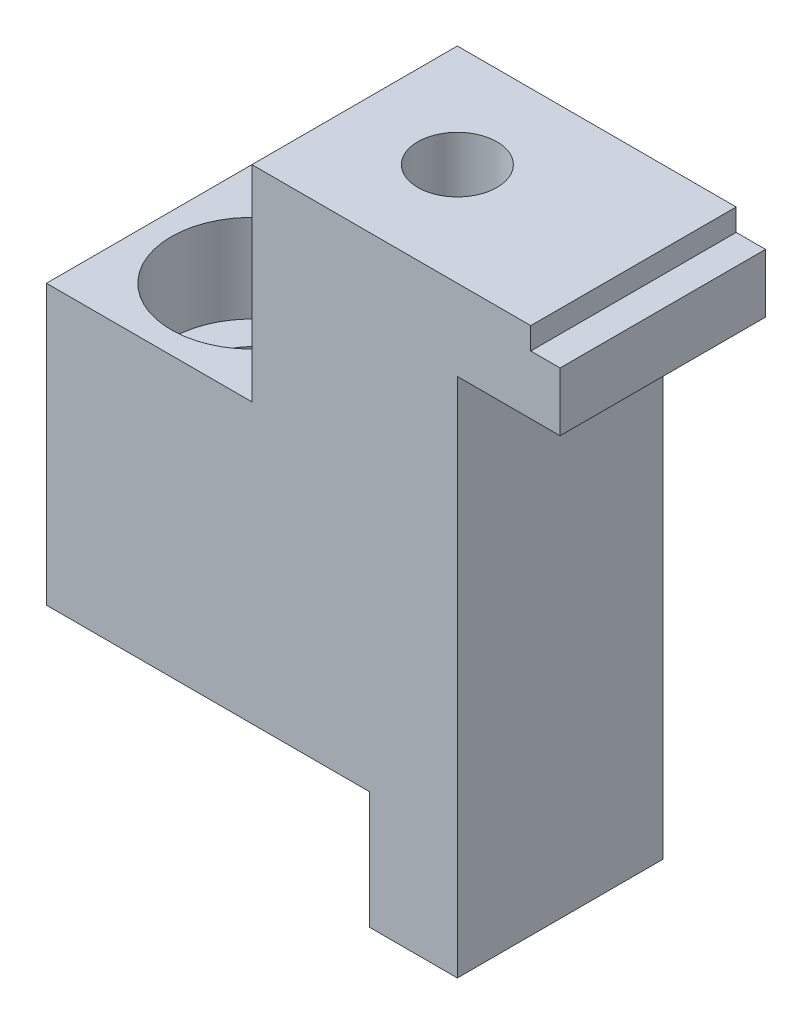
ISO-10303-21;
HEADER;
FILE_DESCRIPTION(('STEP AP214'),'2;1');
FILE_NAME('part.step','',(''),(''),'','','');
FILE_SCHEMA(('AUTOMOTIVE_DESIGN { 1 0 10303 214 1 1 1 1 }'));
ENDSEC;
DATA;
#1=APPLICATION_CONTEXT('core data for automotive mechanical design processes');
#2=APPLICATION_PROTOCOL_DEFINITION('international standard','automotive_design',2000,#1);
#3=PRODUCT_CONTEXT('',#1,'mechanical');
#4=PRODUCT('Part','Part','',(#3));
#5=PRODUCT_RELATED_PRODUCT_CATEGORY('part','',(#4));
#6=PRODUCT_DEFINITION_FORMATION('','',#4);
#7=PRODUCT_DEFINITION_CONTEXT('part definition',#1,'design');
#8=PRODUCT_DEFINITION('design','',#6,#7);
#9=PRODUCT_DEFINITION_SHAPE('','',#8);
#10=(LENGTH_UNIT() NAMED_UNIT(*) SI_UNIT(.MILLI.,.METRE.));
#11=(NAMED_UNIT(*) PLANE_ANGLE_UNIT() SI_UNIT($,.RADIAN.));
#12=(NAMED_UNIT(*) SI_UNIT($,.STERADIAN.) SOLID_ANGLE_UNIT());
#13=UNCERTAINTY_MEASURE_WITH_UNIT(LENGTH_MEASURE(1.E-05),#10,'distance_accuracy_value','');
#14=(GEOMETRIC_REPRESENTATION_CONTEXT(3) GLOBAL_UNCERTAINTY_ASSIGNED_CONTEXT((#13)) GLOBAL_UNIT_ASSIGNED_CONTEXT((#10,
#11,#12)) REPRESENTATION_CONTEXT('',''));
#15=CARTESIAN_POINT('',(0.,0.,0.));
#16=DIRECTION('',(0.,0.,1.));
#17=DIRECTION('',(1.,0.,0.));
#18=AXIS2_PLACEMENT_3D('',#15,#16,#17);
#19=CARTESIAN_POINT('',(-3.5,-4.40000000000001,3.5));
#20=DIRECTION('',(0.,1.,0.));
#21=DIRECTION('',(-1.,0.,0.));
#22=AXIS2_PLACEMENT_3D('',#19,#20,#21);
#23=CYLINDRICAL_SURFACE('',#22,1.6);
#24=CARTESIAN_POINT('',(-3.5,0.,3.5));
#25=DIRECTION('',(0.,1.,0.));
#26=DIRECTION('',(0.,0.,1.));
#27=AXIS2_PLACEMENT_3D('',#24,#25,#26);
#28=CIRCLE('',#27,1.6);
#29=CARTESIAN_POINT('',(-3.5,0.,5.1));
#30=VERTEX_POINT('',#29);
#31=EDGE_CURVE('E439',#30,#30,#28,.T.);
#32=ORIENTED_EDGE('',*,*,#31,.F.);
#33=EDGE_LOOP('',(#32));
#34=FACE_BOUND('',#33,.T.);
#35=CARTESIAN_POINT('',(-3.5,6.5,3.5));
#36=DIRECTION('',(0.,1.,0.));
#37=DIRECTION('',(-1.,0.,0.));
#38=AXIS2_PLACEMENT_3D('',#35,#36,#37);
#39=CIRCLE('',#38,1.6);
#40=CARTESIAN_POINT('',(-5.1,6.5,3.5));
#41=VERTEX_POINT('',#40);
#42=EDGE_CURVE('E36',#41,#41,#39,.F.);
#43=ORIENTED_EDGE('',*,*,#42,.F.);
#44=EDGE_LOOP('',(#43));
#45=FACE_BOUND('',#44,.T.);
#46=ADVANCED_FACE('F32',(#34,#45),#23,.F.);
#47=CARTESIAN_POINT('',(0.,0.,7.));
#48=DIRECTION('',(0.,1.,0.));
#49=DIRECTION('',(0.,0.,1.));
#50=AXIS2_PLACEMENT_3D('',#47,#48,#49);
#51=PLANE('',#50);
#52=ORIENTED_EDGE('',*,*,#31,.T.);
#53=EDGE_LOOP('',(#52));
#54=FACE_BOUND('',#53,.T.);
#55=DIRECTION('',(1.,0.,0.));
#56=VECTOR('',#55,1.);
#57=CARTESIAN_POINT('',(0.,0.,0.));
#58=LINE('',#57,#56);
#59=CARTESIAN_POINT('',(-7.,0.,0.));
#60=VERTEX_POINT('',#59);
#61=CARTESIAN_POINT('',(4.,0.,0.));
#62=VERTEX_POINT('',#61);
#63=EDGE_CURVE('E98',#60,#62,#58,.T.);
#64=ORIENTED_EDGE('',*,*,#63,.T.);
#65=DIRECTION('',(0.,0.,-1.));
#66=VECTOR('',#65,1.);
#67=CARTESIAN_POINT('',(4.,0.,7.));
#68=LINE('',#67,#66);
#69=CARTESIAN_POINT('',(4.,0.,7.));
#70=VERTEX_POINT('',#69);
#71=EDGE_CURVE('E11',#70,#62,#68,.T.);
#72=ORIENTED_EDGE('',*,*,#71,.F.);
#73=DIRECTION('',(1.,0.,0.));
#74=VECTOR('',#73,1.);
#75=CARTESIAN_POINT('',(0.,0.,7.));
#76=LINE('',#75,#74);
#77=CARTESIAN_POINT('',(-7.,0.,7.));
#78=VERTEX_POINT('',#77);
#79=EDGE_CURVE('E104',#78,#70,#76,.T.);
#80=ORIENTED_EDGE('',*,*,#79,.F.);
#81=DIRECTION('',(0.,0.,-1.));
#82=VECTOR('',#81,1.);
#83=CARTESIAN_POINT('',(-7.,0.,7.));
#84=LINE('',#83,#82);
#85=EDGE_CURVE('E150',#78,#60,#84,.T.);
#86=ORIENTED_EDGE('',*,*,#85,.T.);
#87=EDGE_LOOP('',(#64,#72,#80,#86));
#88=FACE_BOUND('',#87,.T.);
#89=ADVANCED_FACE('F34',(#54,#88),#51,.F.);
#90=CARTESIAN_POINT('',(4.,0.,7.));
#91=DIRECTION('',(1.,0.,0.));
#92=DIRECTION('',(0.,0.,-1.));
#93=AXIS2_PLACEMENT_3D('',#90,#91,#92);
#94=PLANE('',#93);
#95=DIRECTION('',(0.,-1.,0.));
#96=VECTOR('',#95,1.);
#97=CARTESIAN_POINT('',(4.,0.,0.));
#98=LINE('',#97,#96);
#99=CARTESIAN_POINT('',(4.,-4.,0.));
#100=VERTEX_POINT('',#99);
#101=EDGE_CURVE('E155',#62,#100,#98,.T.);
#102=ORIENTED_EDGE('',*,*,#101,.T.);
#103=DIRECTION('',(0.,0.,-1.));
#104=VECTOR('',#103,1.);
#105=CARTESIAN_POINT('',(4.,-4.,7.));
#106=LINE('',#105,#104);
#107=CARTESIAN_POINT('',(4.,-4.,7.));
#108=VERTEX_POINT('',#107);
#109=EDGE_CURVE('E42',#108,#100,#106,.T.);
#110=ORIENTED_EDGE('',*,*,#109,.F.);
#111=DIRECTION('',(0.,-1.,0.));
#112=VECTOR('',#111,1.);
#113=CARTESIAN_POINT('',(4.,0.,7.));
#114=LINE('',#113,#112);
#115=EDGE_CURVE('E245',#70,#108,#114,.T.);
#116=ORIENTED_EDGE('',*,*,#115,.F.);
#117=ORIENTED_EDGE('',*,*,#71,.T.);
#118=EDGE_LOOP('',(#102,#110,#116,#117));
#119=FACE_BOUND('',#118,.T.);
#120=ADVANCED_FACE('F251',(#119),#94,.F.);
#121=CARTESIAN_POINT('',(7.,-4.,7.));
#122=DIRECTION('',(0.,1.,0.));
#123=DIRECTION('',(0.,0.,1.));
#124=AXIS2_PLACEMENT_3D('',#121,#122,#123);
#125=PLANE('',#124);
#126=DIRECTION('',(1.,0.,0.));
#127=VECTOR('',#126,1.);
#128=CARTESIAN_POINT('',(7.,-4.,0.));
#129=LINE('',#128,#127);
#130=CARTESIAN_POINT('',(7.,-4.,0.));
#131=VERTEX_POINT('',#130);
#132=EDGE_CURVE('E158',#100,#131,#129,.T.);
#133=ORIENTED_EDGE('',*,*,#132,.T.);
#134=DIRECTION('',(0.,0.,-1.));
#135=VECTOR('',#134,1.);
#136=CARTESIAN_POINT('',(7.,-4.,7.));
#137=LINE('',#136,#135);
#138=CARTESIAN_POINT('',(7.,-4.,7.));
#139=VERTEX_POINT('',#138);
#140=EDGE_CURVE('E197',#139,#131,#137,.T.);
#141=ORIENTED_EDGE('',*,*,#140,.F.);
#142=DIRECTION('',(1.,0.,0.));
#143=VECTOR('',#142,1.);
#144=CARTESIAN_POINT('',(7.,-4.,7.));
#145=LINE('',#144,#143);
#146=EDGE_CURVE('E207',#108,#139,#145,.T.);
#147=ORIENTED_EDGE('',*,*,#146,.F.);
#148=ORIENTED_EDGE('',*,*,#109,.T.);
#149=EDGE_LOOP('',(#133,#141,#147,#148));
#150=FACE_BOUND('',#149,.T.);
#151=ADVANCED_FACE('F205',(#150),#125,.F.);
#152=CARTESIAN_POINT('',(7.,0.,7.));
#153=DIRECTION('',(-1.,0.,0.));
#154=DIRECTION('',(0.,0.,1.));
#155=AXIS2_PLACEMENT_3D('',#152,#153,#154);
#156=PLANE('',#155);
#157=DIRECTION('',(0.,1.,0.));
#158=VECTOR('',#157,1.);
#159=CARTESIAN_POINT('',(7.,0.,0.));
#160=LINE('',#159,#158);
#161=CARTESIAN_POINT('',(7.,13.75,0.));
#162=VERTEX_POINT('',#161);
#163=EDGE_CURVE('E161',#131,#162,#160,.T.);
#164=ORIENTED_EDGE('',*,*,#163,.T.);
#165=DIRECTION('',(0.,0.,-1.));
#166=VECTOR('',#165,1.);
#167=CARTESIAN_POINT('',(7.,13.75,7.));
#168=LINE('',#167,#166);
#169=CARTESIAN_POINT('',(7.,13.75,7.));
#170=VERTEX_POINT('',#169);
#171=EDGE_CURVE('E194',#170,#162,#168,.T.);
#172=ORIENTED_EDGE('',*,*,#171,.F.);
#173=DIRECTION('',(0.,1.,0.));
#174=VECTOR('',#173,1.);
#175=CARTESIAN_POINT('',(7.,0.,7.));
#176=LINE('',#175,#174);
#177=EDGE_CURVE('E224',#139,#170,#176,.T.);
#178=ORIENTED_EDGE('',*,*,#177,.F.);
#179=ORIENTED_EDGE('',*,*,#140,.T.);
#180=EDGE_LOOP('',(#164,#172,#178,#179));
#181=FACE_BOUND('',#180,.T.);
#182=ADVANCED_FACE('F215',(#181),#156,.F.);
#183=CARTESIAN_POINT('',(7.,13.75,7.));
#184=DIRECTION('',(0.,1.,0.));
#185=DIRECTION('',(0.,0.,1.));
#186=AXIS2_PLACEMENT_3D('',#183,#184,#185);
#187=PLANE('',#186);
#188=DIRECTION('',(1.,0.,0.));
#189=VECTOR('',#188,1.);
#190=CARTESIAN_POINT('',(7.,13.75,0.));
#191=LINE('',#190,#189);
#192=CARTESIAN_POINT('',(10.5,13.75,0.));
#193=VERTEX_POINT('',#192);
#194=EDGE_CURVE('E163',#162,#193,#191,.T.);
#195=ORIENTED_EDGE('',*,*,#194,.T.);
#196=DIRECTION('',(0.,0.,-1.));
#197=VECTOR('',#196,1.);
#198=CARTESIAN_POINT('',(10.5,13.75,7.));
#199=LINE('',#198,#197);
#200=CARTESIAN_POINT('',(10.5,13.75,7.));
#201=VERTEX_POINT('',#200);
#202=EDGE_CURVE('E191',#201,#193,#199,.T.);
#203=ORIENTED_EDGE('',*,*,#202,.F.);
#204=DIRECTION('',(1.,0.,0.));
#205=VECTOR('',#204,1.);
#206=CARTESIAN_POINT('',(7.,13.75,7.));
#207=LINE('',#206,#205);
#208=EDGE_CURVE('E221',#170,#201,#207,.T.);
#209=ORIENTED_EDGE('',*,*,#208,.F.);
#210=ORIENTED_EDGE('',*,*,#171,.T.);
#211=EDGE_LOOP('',(#195,#203,#209,#210));
#212=FACE_BOUND('',#211,.T.);
#213=ADVANCED_FACE('F219',(#212),#187,.F.);
#214=CARTESIAN_POINT('',(10.5,15.75,7.));
#215=DIRECTION('',(-1.,0.,0.));
#216=DIRECTION('',(0.,0.,1.));
#217=AXIS2_PLACEMENT_3D('',#214,#215,#216);
#218=PLANE('',#217);
#219=DIRECTION('',(0.,1.,0.));
#220=VECTOR('',#219,1.);
#221=CARTESIAN_POINT('',(10.5,15.75,0.));
#222=LINE('',#221,#220);
#223=CARTESIAN_POINT('',(10.5,15.75,0.));
#224=VERTEX_POINT('',#223);
#225=EDGE_CURVE('E165',#193,#224,#222,.T.);
#226=ORIENTED_EDGE('',*,*,#225,.T.);
#227=DIRECTION('',(0.,0.,-1.));
#228=VECTOR('',#227,1.);
#229=CARTESIAN_POINT('',(10.5,15.75,7.));
#230=LINE('',#229,#228);
#231=CARTESIAN_POINT('',(10.5,15.75,7.));
#232=VERTEX_POINT('',#231);
#233=EDGE_CURVE('E188',#232,#224,#230,.T.);
#234=ORIENTED_EDGE('',*,*,#233,.F.);
#235=DIRECTION('',(0.,1.,0.));
#236=VECTOR('',#235,1.);
#237=CARTESIAN_POINT('',(10.5,15.75,7.));
#238=LINE('',#237,#236);
#239=EDGE_CURVE('E223',#201,#232,#238,.T.);
#240=ORIENTED_EDGE('',*,*,#239,.F.);
#241=ORIENTED_EDGE('',*,*,#202,.T.);
#242=EDGE_LOOP('',(#226,#234,#240,#241));
#243=FACE_BOUND('',#242,.T.);
#244=ADVANCED_FACE('F298',(#243),#218,.F.);
#245=CARTESIAN_POINT('',(9.5,15.75,7.));
#246=DIRECTION('',(0.,-1.,0.));
#247=DIRECTION('',(0.,0.,-1.));
#248=AXIS2_PLACEMENT_3D('',#245,#246,#247);
#249=PLANE('',#248);
#250=DIRECTION('',(-1.,0.,0.));
#251=VECTOR('',#250,1.);
#252=CARTESIAN_POINT('',(9.5,15.75,0.));
#253=LINE('',#252,#251);
#254=CARTESIAN_POINT('',(9.5,15.75,0.));
#255=VERTEX_POINT('',#254);
#256=EDGE_CURVE('E167',#224,#255,#253,.T.);
#257=ORIENTED_EDGE('',*,*,#256,.T.);
#258=DIRECTION('',(0.,0.,-1.));
#259=VECTOR('',#258,1.);
#260=CARTESIAN_POINT('',(9.5,15.75,7.));
#261=LINE('',#260,#259);
#262=CARTESIAN_POINT('',(9.5,15.75,7.));
#263=VERTEX_POINT('',#262);
#264=EDGE_CURVE('E185',#263,#255,#261,.T.);
#265=ORIENTED_EDGE('',*,*,#264,.F.);
#266=DIRECTION('',(-1.,0.,0.));
#267=VECTOR('',#266,1.);
#268=CARTESIAN_POINT('',(9.5,15.75,7.));
#269=LINE('',#268,#267);
#270=EDGE_CURVE('E226',#232,#263,#269,.T.);
#271=ORIENTED_EDGE('',*,*,#270,.F.);
#272=ORIENTED_EDGE('',*,*,#233,.T.);
#273=EDGE_LOOP('',(#257,#265,#271,#272));
#274=FACE_BOUND('',#273,.T.);
#275=ADVANCED_FACE('F295',(#274),#249,.F.);
#276=CARTESIAN_POINT('',(9.5,15.75,7.));
#277=DIRECTION('',(-1.,0.,0.));
#278=DIRECTION('',(0.,0.,1.));
#279=AXIS2_PLACEMENT_3D('',#276,#277,#278);
#280=PLANE('',#279);
#281=DIRECTION('',(0.,1.,0.));
#282=VECTOR('',#281,1.);
#283=CARTESIAN_POINT('',(9.5,15.75,0.));
#284=LINE('',#283,#282);
#285=CARTESIAN_POINT('',(9.5,16.5,0.));
#286=VERTEX_POINT('',#285);
#287=EDGE_CURVE('E169',#255,#286,#284,.T.);
#288=ORIENTED_EDGE('',*,*,#287,.T.);
#289=DIRECTION('',(0.,0.,-1.));
#290=VECTOR('',#289,1.);
#291=CARTESIAN_POINT('',(9.5,16.5,7.));
#292=LINE('',#291,#290);
#293=CARTESIAN_POINT('',(9.5,16.5,7.));
#294=VERTEX_POINT('',#293);
#295=EDGE_CURVE('E182',#294,#286,#292,.T.);
#296=ORIENTED_EDGE('',*,*,#295,.F.);
#297=DIRECTION('',(0.,1.,0.));
#298=VECTOR('',#297,1.);
#299=CARTESIAN_POINT('',(9.5,15.75,7.));
#300=LINE('',#299,#298);
#301=EDGE_CURVE('E232',#263,#294,#300,.T.);
#302=ORIENTED_EDGE('',*,*,#301,.F.);
#303=ORIENTED_EDGE('',*,*,#264,.T.);
#304=EDGE_LOOP('',(#288,#296,#302,#303));
#305=FACE_BOUND('',#304,.T.);
#306=ADVANCED_FACE('F238',(#305),#280,.F.);
#307=CARTESIAN_POINT('',(7.,16.5,7.));
#308=DIRECTION('',(0.,-1.,0.));
#309=DIRECTION('',(0.,0.,-1.));
#310=AXIS2_PLACEMENT_3D('',#307,#308,#309);
#311=PLANE('',#310);
#312=CARTESIAN_POINT('',(3.5,16.5,3.5));
#313=DIRECTION('',(0.,1.,0.));
#314=DIRECTION('',(0.,0.,1.));
#315=AXIS2_PLACEMENT_3D('',#312,#313,#314);
#316=CIRCLE('',#315,1.35);
#317=CARTESIAN_POINT('',(3.5,16.5,4.85));
#318=VERTEX_POINT('',#317);
#319=EDGE_CURVE('E249',#318,#318,#316,.T.);
#320=ORIENTED_EDGE('',*,*,#319,.F.);
#321=EDGE_LOOP('',(#320));
#322=FACE_BOUND('',#321,.T.);
#323=DIRECTION('',(-1.,0.,0.));
#324=VECTOR('',#323,1.);
#325=CARTESIAN_POINT('',(7.,16.5,0.));
#326=LINE('',#325,#324);
#327=CARTESIAN_POINT('',(0.,16.5,0.));
#328=VERTEX_POINT('',#327);
#329=EDGE_CURVE('E172',#286,#328,#326,.T.);
#330=ORIENTED_EDGE('',*,*,#329,.T.);
#331=DIRECTION('',(0.,0.,-1.));
#332=VECTOR('',#331,1.);
#333=CARTESIAN_POINT('',(0.,16.5,7.));
#334=LINE('',#333,#332);
#335=CARTESIAN_POINT('',(0.,16.5,7.));
#336=VERTEX_POINT('',#335);
#337=EDGE_CURVE('E145',#336,#328,#334,.T.);
#338=ORIENTED_EDGE('',*,*,#337,.F.);
#339=DIRECTION('',(-1.,0.,0.));
#340=VECTOR('',#339,1.);
#341=CARTESIAN_POINT('',(7.,16.5,7.));
#342=LINE('',#341,#340);
#343=EDGE_CURVE('E136',#294,#336,#342,.T.);
#344=ORIENTED_EDGE('',*,*,#343,.F.);
#345=ORIENTED_EDGE('',*,*,#295,.T.);
#346=EDGE_LOOP('',(#330,#338,#344,#345));
#347=FACE_BOUND('',#346,.T.);
#348=ADVANCED_FACE('F241',(#322,#347),#311,.F.);
#349=CARTESIAN_POINT('',(0.,9.5,7.));
#350=DIRECTION('',(1.,0.,0.));
#351=DIRECTION('',(0.,0.,-1.));
#352=AXIS2_PLACEMENT_3D('',#349,#350,#351);
#353=PLANE('',#352);
#354=DIRECTION('',(0.,-1.,0.));
#355=VECTOR('',#354,1.);
#356=CARTESIAN_POINT('',(0.,9.5,0.));
#357=LINE('',#356,#355);
#358=CARTESIAN_POINT('',(0.,9.5,0.));
#359=VERTEX_POINT('',#358);
#360=EDGE_CURVE('E144',#328,#359,#357,.T.);
#361=ORIENTED_EDGE('',*,*,#360,.T.);
#362=DIRECTION('',(0.,0.,-1.));
#363=VECTOR('',#362,1.);
#364=CARTESIAN_POINT('',(0.,9.5,7.));
#365=LINE('',#364,#363);
#366=CARTESIAN_POINT('',(0.,9.5,7.));
#367=VERTEX_POINT('',#366);
#368=EDGE_CURVE('E141',#367,#359,#365,.T.);
#369=ORIENTED_EDGE('',*,*,#368,.F.);
#370=DIRECTION('',(0.,-1.,0.));
#371=VECTOR('',#370,1.);
#372=CARTESIAN_POINT('',(0.,9.5,7.));
#373=LINE('',#372,#371);
#374=EDGE_CURVE('E130',#336,#367,#373,.T.);
#375=ORIENTED_EDGE('',*,*,#374,.F.);
#376=ORIENTED_EDGE('',*,*,#337,.T.);
#377=EDGE_LOOP('',(#361,#369,#375,#376));
#378=FACE_BOUND('',#377,.T.);
#379=ADVANCED_FACE('F142',(#378),#353,.F.);
#380=CARTESIAN_POINT('',(0.,9.5,7.));
#381=DIRECTION('',(0.,-1.,0.));
#382=DIRECTION('',(0.,0.,-1.));
#383=AXIS2_PLACEMENT_3D('',#380,#381,#382);
#384=PLANE('',#383);
#385=CARTESIAN_POINT('',(-3.5,9.5,3.5));
#386=DIRECTION('',(0.,1.,0.));
#387=DIRECTION('',(-1.,0.,0.));
#388=AXIS2_PLACEMENT_3D('',#385,#386,#387);
#389=CIRCLE('',#388,2.75);
#390=CARTESIAN_POINT('',(-6.25,9.5,3.5));
#391=VERTEX_POINT('',#390);
#392=EDGE_CURVE('E435',#391,#391,#389,.T.);
#393=ORIENTED_EDGE('',*,*,#392,.F.);
#394=EDGE_LOOP('',(#393));
#395=FACE_BOUND('',#394,.T.);
#396=DIRECTION('',(-1.,0.,0.));
#397=VECTOR('',#396,1.);
#398=CARTESIAN_POINT('',(0.,9.5,0.));
#399=LINE('',#398,#397);
#400=CARTESIAN_POINT('',(-7.,9.5,0.));
#401=VERTEX_POINT('',#400);
#402=EDGE_CURVE('E91',#359,#401,#399,.T.);
#403=ORIENTED_EDGE('',*,*,#402,.T.);
#404=DIRECTION('',(0.,0.,-1.));
#405=VECTOR('',#404,1.);
#406=CARTESIAN_POINT('',(-7.,9.5,7.));
#407=LINE('',#406,#405);
#408=CARTESIAN_POINT('',(-7.,9.5,7.));
#409=VERTEX_POINT('',#408);
#410=EDGE_CURVE('E146',#409,#401,#407,.T.);
#411=ORIENTED_EDGE('',*,*,#410,.F.);
#412=DIRECTION('',(-1.,0.,0.));
#413=VECTOR('',#412,1.);
#414=CARTESIAN_POINT('',(0.,9.5,7.));
#415=LINE('',#414,#413);
#416=EDGE_CURVE('E134',#367,#409,#415,.T.);
#417=ORIENTED_EDGE('',*,*,#416,.F.);
#418=ORIENTED_EDGE('',*,*,#368,.T.);
#419=EDGE_LOOP('',(#403,#411,#417,#418));
#420=FACE_BOUND('',#419,.T.);
#421=ADVANCED_FACE('F148',(#395,#420),#384,.F.);
#422=CARTESIAN_POINT('',(-7.,0.,7.));
#423=DIRECTION('',(1.,0.,0.));
#424=DIRECTION('',(0.,0.,-1.));
#425=AXIS2_PLACEMENT_3D('',#422,#423,#424);
#426=PLANE('',#425);
#427=DIRECTION('',(0.,-1.,0.));
#428=VECTOR('',#427,1.);
#429=CARTESIAN_POINT('',(-7.,0.,0.));
#430=LINE('',#429,#428);
#431=EDGE_CURVE('E176',#401,#60,#430,.T.);
#432=ORIENTED_EDGE('',*,*,#431,.T.);
#433=ORIENTED_EDGE('',*,*,#85,.F.);
#434=DIRECTION('',(0.,-1.,0.));
#435=VECTOR('',#434,1.);
#436=CARTESIAN_POINT('',(-7.,0.,7.));
#437=LINE('',#436,#435);
#438=EDGE_CURVE('E50',#409,#78,#437,.T.);
#439=ORIENTED_EDGE('',*,*,#438,.F.);
#440=ORIENTED_EDGE('',*,*,#410,.T.);
#441=EDGE_LOOP('',(#432,#433,#439,#440));
#442=FACE_BOUND('',#441,.T.);
#443=ADVANCED_FACE('F243',(#442),#426,.F.);
#444=CARTESIAN_POINT('',(0.,0.,7.));
#445=DIRECTION('',(0.,0.,-1.));
#446=DIRECTION('',(-1.,0.,0.));
#447=AXIS2_PLACEMENT_3D('',#444,#445,#446);
#448=PLANE('',#447);
#449=ORIENTED_EDGE('',*,*,#79,.T.);
#450=ORIENTED_EDGE('',*,*,#115,.T.);
#451=ORIENTED_EDGE('',*,*,#146,.T.);
#452=ORIENTED_EDGE('',*,*,#177,.T.);
#453=ORIENTED_EDGE('',*,*,#208,.T.);
#454=ORIENTED_EDGE('',*,*,#239,.T.);
#455=ORIENTED_EDGE('',*,*,#270,.T.);
#456=ORIENTED_EDGE('',*,*,#301,.T.);
#457=ORIENTED_EDGE('',*,*,#343,.T.);
#458=ORIENTED_EDGE('',*,*,#374,.T.);
#459=ORIENTED_EDGE('',*,*,#416,.T.);
#460=ORIENTED_EDGE('',*,*,#438,.T.);
#461=EDGE_LOOP('',(#449,#450,#451,#452,#453,#454,#455,#456,#457,#458,#459,#460));
#462=FACE_BOUND('',#461,.T.);
#463=ADVANCED_FACE('F132',(#462),#448,.F.);
#464=CARTESIAN_POINT('',(0.,0.,0.));
#465=DIRECTION('',(0.,0.,-1.));
#466=DIRECTION('',(-1.,0.,0.));
#467=AXIS2_PLACEMENT_3D('',#464,#465,#466);
#468=PLANE('',#467);
#469=ORIENTED_EDGE('',*,*,#63,.F.);
#470=ORIENTED_EDGE('',*,*,#431,.F.);
#471=ORIENTED_EDGE('',*,*,#402,.F.);
#472=ORIENTED_EDGE('',*,*,#360,.F.);
#473=ORIENTED_EDGE('',*,*,#329,.F.);
#474=ORIENTED_EDGE('',*,*,#287,.F.);
#475=ORIENTED_EDGE('',*,*,#256,.F.);
#476=ORIENTED_EDGE('',*,*,#225,.F.);
#477=ORIENTED_EDGE('',*,*,#194,.F.);
#478=ORIENTED_EDGE('',*,*,#163,.F.);
#479=ORIENTED_EDGE('',*,*,#132,.F.);
#480=ORIENTED_EDGE('',*,*,#101,.F.);
#481=EDGE_LOOP('',(#469,#470,#471,#472,#473,#474,#475,#476,#477,#478,#479,#480));
#482=FACE_BOUND('',#481,.T.);
#483=ADVANCED_FACE('F210',(#482),#468,.T.);
#484=CARTESIAN_POINT('',(3.5,3.,3.5));
#485=DIRECTION('',(0.,1.,0.));
#486=DIRECTION('',(0.,0.,1.));
#487=AXIS2_PLACEMENT_3D('',#484,#485,#486);
#488=CYLINDRICAL_SURFACE('',#487,1.35);
#489=CARTESIAN_POINT('',(3.5,3.,3.5));
#490=DIRECTION('',(0.,1.,0.));
#491=DIRECTION('',(0.,0.,1.));
#492=AXIS2_PLACEMENT_3D('',#489,#490,#491);
#493=CIRCLE('',#492,1.35);
#494=CARTESIAN_POINT('',(3.5,3.,4.85));
#495=VERTEX_POINT('',#494);
#496=EDGE_CURVE('E156',#495,#495,#493,.T.);
#497=ORIENTED_EDGE('',*,*,#496,.F.);
#498=EDGE_LOOP('',(#497));
#499=FACE_BOUND('',#498,.T.);
#500=ORIENTED_EDGE('',*,*,#319,.T.);
#501=EDGE_LOOP('',(#500));
#502=FACE_BOUND('',#501,.T.);
#503=ADVANCED_FACE('F274',(#499,#502),#488,.F.);
#504=CARTESIAN_POINT('',(3.5,3.,3.5));
#505=DIRECTION('',(0.,1.,0.));
#506=DIRECTION('',(0.,0.,1.));
#507=AXIS2_PLACEMENT_3D('',#504,#505,#506);
#508=PLANE('',#507);
#509=ORIENTED_EDGE('',*,*,#496,.T.);
#510=EDGE_LOOP('',(#509));
#511=FACE_BOUND('',#510,.T.);
#512=ADVANCED_FACE('F270',(#511),#508,.T.);
#513=CARTESIAN_POINT('',(-3.5,6.5,3.5));
#514=DIRECTION('',(0.,1.,0.));
#515=DIRECTION('',(-1.,0.,0.));
#516=AXIS2_PLACEMENT_3D('',#513,#514,#515);
#517=PLANE('',#516);
#518=CARTESIAN_POINT('',(-3.5,6.5,3.5));
#519=DIRECTION('',(0.,1.,0.));
#520=DIRECTION('',(-1.,0.,0.));
#521=AXIS2_PLACEMENT_3D('',#518,#519,#520);
#522=CIRCLE('',#521,2.75);
#523=CARTESIAN_POINT('',(-6.25,6.5,3.5));
#524=VERTEX_POINT('',#523);
#525=EDGE_CURVE('E432',#524,#524,#522,.T.);
#526=ORIENTED_EDGE('',*,*,#525,.T.);
#527=EDGE_LOOP('',(#526));
#528=FACE_BOUND('',#527,.T.);
#529=ORIENTED_EDGE('',*,*,#42,.T.);
#530=EDGE_LOOP('',(#529));
#531=FACE_BOUND('',#530,.T.);
#532=ADVANCED_FACE('F273',(#528,#531),#517,.T.);
#533=CARTESIAN_POINT('',(-3.5,6.5,3.5));
#534=DIRECTION('',(0.,1.,0.));
#535=DIRECTION('',(-1.,0.,0.));
#536=AXIS2_PLACEMENT_3D('',#533,#534,#535);
#537=CYLINDRICAL_SURFACE('',#536,2.75);
#538=ORIENTED_EDGE('',*,*,#525,.F.);
#539=EDGE_LOOP('',(#538));
#540=FACE_BOUND('',#539,.T.);
#541=ORIENTED_EDGE('',*,*,#392,.T.);
#542=EDGE_LOOP('',(#541));
#543=FACE_BOUND('',#542,.T.);
#544=ADVANCED_FACE('F268',(#540,#543),#537,.F.);
#545=CLOSED_SHELL('',(#46,#89,#120,#151,#182,#213,#244,#275,#306,#348,#379,#421,#443,#463,#483,
#503,#512,#532,#544));
#546=MANIFOLD_SOLID_BREP('B2',#545);
#547=ADVANCED_BREP_SHAPE_REPRESENTATION('',(#18,#546),#14);
#548=SHAPE_DEFINITION_REPRESENTATION(#9,#547);
ENDSEC;
END-ISO-10303-21;
